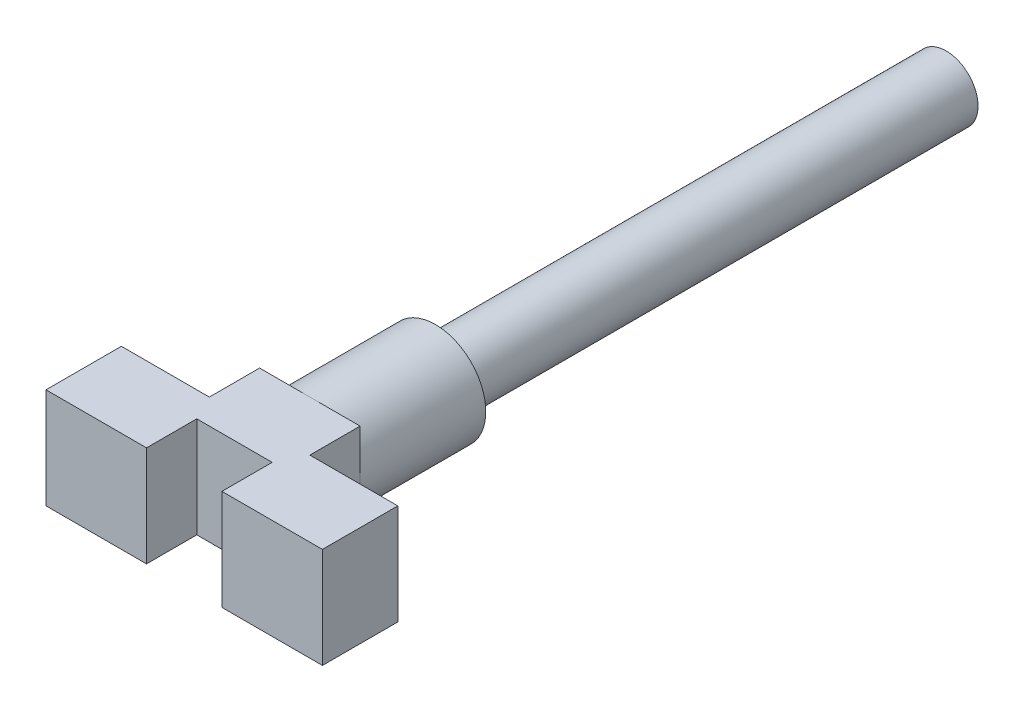
ISO-10303-21;
HEADER;
FILE_DESCRIPTION(('STEP AP214'),'2;1');
FILE_NAME('part.step','',(''),(''),'','','');
FILE_SCHEMA(('AUTOMOTIVE_DESIGN { 1 0 10303 214 1 1 1 1 }'));
ENDSEC;
DATA;
#1=APPLICATION_CONTEXT('core data for automotive mechanical design processes');
#2=APPLICATION_PROTOCOL_DEFINITION('international standard','automotive_design',2000,#1);
#3=PRODUCT_CONTEXT('',#1,'mechanical');
#4=PRODUCT('Part','Part','',(#3));
#5=PRODUCT_RELATED_PRODUCT_CATEGORY('part','',(#4));
#6=PRODUCT_DEFINITION_FORMATION('','',#4);
#7=PRODUCT_DEFINITION_CONTEXT('part definition',#1,'design');
#8=PRODUCT_DEFINITION('design','',#6,#7);
#9=PRODUCT_DEFINITION_SHAPE('','',#8);
#10=(LENGTH_UNIT() NAMED_UNIT(*) SI_UNIT(.MILLI.,.METRE.));
#11=(NAMED_UNIT(*) PLANE_ANGLE_UNIT() SI_UNIT($,.RADIAN.));
#12=(NAMED_UNIT(*) SI_UNIT($,.STERADIAN.) SOLID_ANGLE_UNIT());
#13=UNCERTAINTY_MEASURE_WITH_UNIT(LENGTH_MEASURE(1.E-05),#10,'distance_accuracy_value','');
#14=(GEOMETRIC_REPRESENTATION_CONTEXT(3) GLOBAL_UNCERTAINTY_ASSIGNED_CONTEXT((#13)) GLOBAL_UNIT_ASSIGNED_CONTEXT((#10,
#11,#12)) REPRESENTATION_CONTEXT('',''));
#15=CARTESIAN_POINT('',(0.,0.,0.));
#16=DIRECTION('',(0.,0.,1.));
#17=DIRECTION('',(1.,0.,0.));
#18=AXIS2_PLACEMENT_3D('',#15,#16,#17);
#19=CARTESIAN_POINT('',(0.,0.,-17.5));
#20=DIRECTION('',(0.,0.,-1.));
#21=DIRECTION('',(-1.,0.,0.));
#22=AXIS2_PLACEMENT_3D('',#19,#20,#21);
#23=PLANE('',#22);
#24=CARTESIAN_POINT('',(0.,0.,-17.5));
#25=DIRECTION('',(0.,0.,-1.));
#26=DIRECTION('',(-1.,0.,0.));
#27=AXIS2_PLACEMENT_3D('',#24,#25,#26);
#28=CIRCLE('',#27,5.);
#29=CARTESIAN_POINT('',(-5.,0.,-17.5));
#30=VERTEX_POINT('',#29);
#31=EDGE_CURVE('E157',#30,#30,#28,.T.);
#32=ORIENTED_EDGE('',*,*,#31,.T.);
#33=EDGE_LOOP('',(#32));
#34=FACE_BOUND('',#33,.T.);
#35=CARTESIAN_POINT('',(0.,0.,-17.5));
#36=DIRECTION('',(0.,0.,-1.));
#37=DIRECTION('',(-1.,0.,0.));
#38=AXIS2_PLACEMENT_3D('',#35,#36,#37);
#39=CIRCLE('',#38,3.175);
#40=CARTESIAN_POINT('',(-3.175,0.,-17.5));
#41=VERTEX_POINT('',#40);
#42=EDGE_CURVE('E469',#41,#41,#39,.T.);
#43=ORIENTED_EDGE('',*,*,#42,.F.);
#44=EDGE_LOOP('',(#43));
#45=FACE_BOUND('',#44,.T.);
#46=ADVANCED_FACE('F31',(#34,#45),#23,.T.);
#47=CARTESIAN_POINT('',(5.,5.,-5.));
#48=DIRECTION('',(0.,0.,1.));
#49=DIRECTION('',(1.,0.,0.));
#50=AXIS2_PLACEMENT_3D('',#47,#48,#49);
#51=PLANE('',#50);
#52=CARTESIAN_POINT('',(0.,0.,-5.));
#53=DIRECTION('',(0.,0.,-1.));
#54=DIRECTION('',(-1.,0.,0.));
#55=AXIS2_PLACEMENT_3D('',#52,#53,#54);
#56=CIRCLE('',#55,5.);
#57=CARTESIAN_POINT('',(-5.,0.,-5.));
#58=VERTEX_POINT('',#57);
#59=CARTESIAN_POINT('',(0.,5.,-5.));
#60=VERTEX_POINT('',#59);
#61=EDGE_CURVE('E42',#58,#60,#56,.T.);
#62=ORIENTED_EDGE('',*,*,#61,.F.);
#63=DIRECTION('',(0.,-1.,0.));
#64=VECTOR('',#63,1.);
#65=CARTESIAN_POINT('',(-5.,5.,-5.));
#66=LINE('',#65,#64);
#67=CARTESIAN_POINT('',(-5.,5.,-5.));
#68=VERTEX_POINT('',#67);
#69=EDGE_CURVE('E134',#68,#58,#66,.T.);
#70=ORIENTED_EDGE('',*,*,#69,.F.);
#71=DIRECTION('',(-1.,0.,0.));
#72=VECTOR('',#71,1.);
#73=CARTESIAN_POINT('',(5.,5.,-5.));
#74=LINE('',#73,#72);
#75=EDGE_CURVE('E154',#60,#68,#74,.T.);
#76=ORIENTED_EDGE('',*,*,#75,.F.);
#77=EDGE_LOOP('',(#62,#70,#76));
#78=FACE_BOUND('',#77,.T.);
#79=ADVANCED_FACE('F153',(#78),#51,.F.);
#80=CARTESIAN_POINT('',(5.,0.,-5.));
#81=VERTEX_POINT('',#80);
#82=EDGE_CURVE('E11',#60,#81,#56,.T.);
#83=ORIENTED_EDGE('',*,*,#82,.F.);
#84=CARTESIAN_POINT('',(5.,5.,-5.));
#85=VERTEX_POINT('',#84);
#86=EDGE_CURVE('E167',#85,#60,#74,.T.);
#87=ORIENTED_EDGE('',*,*,#86,.F.);
#88=DIRECTION('',(0.,-1.,0.));
#89=VECTOR('',#88,1.);
#90=CARTESIAN_POINT('',(5.,5.,-5.));
#91=LINE('',#90,#89);
#92=EDGE_CURVE('E35',#85,#81,#91,.T.);
#93=ORIENTED_EDGE('',*,*,#92,.T.);
#94=EDGE_LOOP('',(#83,#87,#93));
#95=FACE_BOUND('',#94,.T.);
#96=ADVANCED_FACE('F265',(#95),#51,.F.);
#97=CARTESIAN_POINT('',(0.,-5.,-5.));
#98=VERTEX_POINT('',#97);
#99=EDGE_CURVE('E40',#81,#98,#56,.T.);
#100=ORIENTED_EDGE('',*,*,#99,.F.);
#101=CARTESIAN_POINT('',(5.,-5.,-5.));
#102=VERTEX_POINT('',#101);
#103=EDGE_CURVE('E143',#81,#102,#91,.T.);
#104=ORIENTED_EDGE('',*,*,#103,.T.);
#105=DIRECTION('',(-1.,0.,0.));
#106=VECTOR('',#105,1.);
#107=CARTESIAN_POINT('',(5.,-5.,-5.));
#108=LINE('',#107,#106);
#109=EDGE_CURVE('E192',#102,#98,#108,.T.);
#110=ORIENTED_EDGE('',*,*,#109,.T.);
#111=EDGE_LOOP('',(#100,#104,#110));
#112=FACE_BOUND('',#111,.T.);
#113=ADVANCED_FACE('F268',(#112),#51,.F.);
#114=EDGE_CURVE('E147',#98,#58,#56,.T.);
#115=ORIENTED_EDGE('',*,*,#114,.F.);
#116=CARTESIAN_POINT('',(-5.,-5.,-5.));
#117=VERTEX_POINT('',#116);
#118=EDGE_CURVE('E149',#98,#117,#108,.T.);
#119=ORIENTED_EDGE('',*,*,#118,.T.);
#120=EDGE_CURVE('E137',#58,#117,#66,.T.);
#121=ORIENTED_EDGE('',*,*,#120,.F.);
#122=EDGE_LOOP('',(#115,#119,#121));
#123=FACE_BOUND('',#122,.T.);
#124=ADVANCED_FACE('F145',(#123),#51,.F.);
#125=CARTESIAN_POINT('',(5.,5.,0.));
#126=DIRECTION('',(-1.,0.,0.));
#127=DIRECTION('',(0.,0.,1.));
#128=AXIS2_PLACEMENT_3D('',#125,#126,#127);
#129=PLANE('',#128);
#130=DIRECTION('',(0.,0.,-1.));
#131=VECTOR('',#130,1.);
#132=CARTESIAN_POINT('',(5.,-5.,0.));
#133=LINE('',#132,#131);
#134=CARTESIAN_POINT('',(5.,-5.,0.));
#135=VERTEX_POINT('',#134);
#136=EDGE_CURVE('E189',#135,#102,#133,.T.);
#137=ORIENTED_EDGE('',*,*,#136,.T.);
#138=ORIENTED_EDGE('',*,*,#103,.F.);
#139=ORIENTED_EDGE('',*,*,#92,.F.);
#140=DIRECTION('',(0.,0.,-1.));
#141=VECTOR('',#140,1.);
#142=CARTESIAN_POINT('',(5.,5.,0.));
#143=LINE('',#142,#141);
#144=CARTESIAN_POINT('',(5.,5.,0.));
#145=VERTEX_POINT('',#144);
#146=EDGE_CURVE('E163',#145,#85,#143,.T.);
#147=ORIENTED_EDGE('',*,*,#146,.F.);
#148=DIRECTION('',(0.,-1.,0.));
#149=VECTOR('',#148,1.);
#150=CARTESIAN_POINT('',(5.,5.,0.));
#151=LINE('',#150,#149);
#152=EDGE_CURVE('E188',#145,#135,#151,.T.);
#153=ORIENTED_EDGE('',*,*,#152,.T.);
#154=EDGE_LOOP('',(#137,#138,#139,#147,#153));
#155=FACE_BOUND('',#154,.T.);
#156=ADVANCED_FACE('F33',(#155),#129,.F.);
#157=CARTESIAN_POINT('',(-5.,5.,-5.));
#158=DIRECTION('',(1.,0.,0.));
#159=DIRECTION('',(0.,0.,-1.));
#160=AXIS2_PLACEMENT_3D('',#157,#158,#159);
#161=PLANE('',#160);
#162=DIRECTION('',(0.,0.,1.));
#163=VECTOR('',#162,1.);
#164=CARTESIAN_POINT('',(-5.,-5.,-5.));
#165=LINE('',#164,#163);
#166=CARTESIAN_POINT('',(-5.,-5.,0.));
#167=VERTEX_POINT('',#166);
#168=EDGE_CURVE('E194',#117,#167,#165,.T.);
#169=ORIENTED_EDGE('',*,*,#168,.T.);
#170=DIRECTION('',(0.,-1.,0.));
#171=VECTOR('',#170,1.);
#172=CARTESIAN_POINT('',(-5.,5.,0.));
#173=LINE('',#172,#171);
#174=CARTESIAN_POINT('',(-5.,5.,0.));
#175=VERTEX_POINT('',#174);
#176=EDGE_CURVE('E151',#175,#167,#173,.T.);
#177=ORIENTED_EDGE('',*,*,#176,.F.);
#178=DIRECTION('',(0.,0.,1.));
#179=VECTOR('',#178,1.);
#180=CARTESIAN_POINT('',(-5.,5.,-5.));
#181=LINE('',#180,#179);
#182=EDGE_CURVE('E140',#68,#175,#181,.T.);
#183=ORIENTED_EDGE('',*,*,#182,.F.);
#184=ORIENTED_EDGE('',*,*,#69,.T.);
#185=ORIENTED_EDGE('',*,*,#120,.T.);
#186=EDGE_LOOP('',(#169,#177,#183,#184,#185));
#187=FACE_BOUND('',#186,.T.);
#188=ADVANCED_FACE('F136',(#187),#161,.F.);
#189=CARTESIAN_POINT('',(-5.,5.,0.));
#190=DIRECTION('',(0.,0.,1.));
#191=DIRECTION('',(1.,0.,0.));
#192=AXIS2_PLACEMENT_3D('',#189,#190,#191);
#193=PLANE('',#192);
#194=DIRECTION('',(-1.,0.,0.));
#195=VECTOR('',#194,1.);
#196=CARTESIAN_POINT('',(-5.,-5.,0.));
#197=LINE('',#196,#195);
#198=CARTESIAN_POINT('',(-13.75,-5.,0.));
#199=VERTEX_POINT('',#198);
#200=EDGE_CURVE('E196',#167,#199,#197,.T.);
#201=ORIENTED_EDGE('',*,*,#200,.T.);
#202=DIRECTION('',(0.,-1.,0.));
#203=VECTOR('',#202,1.);
#204=CARTESIAN_POINT('',(-13.75,5.,0.));
#205=LINE('',#204,#203);
#206=CARTESIAN_POINT('',(-13.75,5.,0.));
#207=VERTEX_POINT('',#206);
#208=EDGE_CURVE('E236',#207,#199,#205,.T.);
#209=ORIENTED_EDGE('',*,*,#208,.F.);
#210=DIRECTION('',(-1.,0.,0.));
#211=VECTOR('',#210,1.);
#212=CARTESIAN_POINT('',(-5.,5.,0.));
#213=LINE('',#212,#211);
#214=EDGE_CURVE('E170',#175,#207,#213,.T.);
#215=ORIENTED_EDGE('',*,*,#214,.F.);
#216=ORIENTED_EDGE('',*,*,#176,.T.);
#217=EDGE_LOOP('',(#201,#209,#215,#216));
#218=FACE_BOUND('',#217,.T.);
#219=ADVANCED_FACE('F243',(#218),#193,.F.);
#220=CARTESIAN_POINT('',(-13.75,5.,0.));
#221=DIRECTION('',(1.,0.,0.));
#222=DIRECTION('',(0.,0.,-1.));
#223=AXIS2_PLACEMENT_3D('',#220,#221,#222);
#224=PLANE('',#223);
#225=DIRECTION('',(0.,0.,1.));
#226=VECTOR('',#225,1.);
#227=CARTESIAN_POINT('',(-13.75,-5.,0.));
#228=LINE('',#227,#226);
#229=CARTESIAN_POINT('',(-13.75,-5.,7.5));
#230=VERTEX_POINT('',#229);
#231=EDGE_CURVE('E198',#199,#230,#228,.T.);
#232=ORIENTED_EDGE('',*,*,#231,.T.);
#233=DIRECTION('',(0.,-1.,0.));
#234=VECTOR('',#233,1.);
#235=CARTESIAN_POINT('',(-13.75,5.,7.5));
#236=LINE('',#235,#234);
#237=CARTESIAN_POINT('',(-13.75,5.,7.5));
#238=VERTEX_POINT('',#237);
#239=EDGE_CURVE('E233',#238,#230,#236,.T.);
#240=ORIENTED_EDGE('',*,*,#239,.F.);
#241=DIRECTION('',(0.,0.,1.));
#242=VECTOR('',#241,1.);
#243=CARTESIAN_POINT('',(-13.75,5.,0.));
#244=LINE('',#243,#242);
#245=EDGE_CURVE('E172',#207,#238,#244,.T.);
#246=ORIENTED_EDGE('',*,*,#245,.F.);
#247=ORIENTED_EDGE('',*,*,#208,.T.);
#248=EDGE_LOOP('',(#232,#240,#246,#247));
#249=FACE_BOUND('',#248,.T.);
#250=ADVANCED_FACE('F253',(#249),#224,.F.);
#251=CARTESIAN_POINT('',(-13.75,5.,7.5));
#252=DIRECTION('',(0.,0.,-1.));
#253=DIRECTION('',(-1.,0.,0.));
#254=AXIS2_PLACEMENT_3D('',#251,#252,#253);
#255=PLANE('',#254);
#256=DIRECTION('',(1.,0.,0.));
#257=VECTOR('',#256,1.);
#258=CARTESIAN_POINT('',(-13.75,-5.,7.5));
#259=LINE('',#258,#257);
#260=CARTESIAN_POINT('',(-3.75,-5.,7.5));
#261=VERTEX_POINT('',#260);
#262=EDGE_CURVE('E200',#230,#261,#259,.T.);
#263=ORIENTED_EDGE('',*,*,#262,.T.);
#264=DIRECTION('',(0.,-1.,0.));
#265=VECTOR('',#264,1.);
#266=CARTESIAN_POINT('',(-3.75,5.,7.5));
#267=LINE('',#266,#265);
#268=CARTESIAN_POINT('',(-3.75,5.,7.5));
#269=VERTEX_POINT('',#268);
#270=EDGE_CURVE('E230',#269,#261,#267,.T.);
#271=ORIENTED_EDGE('',*,*,#270,.F.);
#272=DIRECTION('',(1.,0.,0.));
#273=VECTOR('',#272,1.);
#274=CARTESIAN_POINT('',(-13.75,5.,7.5));
#275=LINE('',#274,#273);
#276=EDGE_CURVE('E174',#238,#269,#275,.T.);
#277=ORIENTED_EDGE('',*,*,#276,.F.);
#278=ORIENTED_EDGE('',*,*,#239,.T.);
#279=EDGE_LOOP('',(#263,#271,#277,#278));
#280=FACE_BOUND('',#279,.T.);
#281=ADVANCED_FACE('F257',(#280),#255,.F.);
#282=CARTESIAN_POINT('',(-3.75,5.,7.5));
#283=DIRECTION('',(-1.,0.,0.));
#284=DIRECTION('',(0.,0.,1.));
#285=AXIS2_PLACEMENT_3D('',#282,#283,#284);
#286=PLANE('',#285);
#287=DIRECTION('',(0.,0.,-1.));
#288=VECTOR('',#287,1.);
#289=CARTESIAN_POINT('',(-3.75,-5.,7.5));
#290=LINE('',#289,#288);
#291=CARTESIAN_POINT('',(-3.75,-5.,2.5));
#292=VERTEX_POINT('',#291);
#293=EDGE_CURVE('E202',#261,#292,#290,.T.);
#294=ORIENTED_EDGE('',*,*,#293,.T.);
#295=DIRECTION('',(0.,-1.,0.));
#296=VECTOR('',#295,1.);
#297=CARTESIAN_POINT('',(-3.75,5.,2.5));
#298=LINE('',#297,#296);
#299=CARTESIAN_POINT('',(-3.75,5.,2.5));
#300=VERTEX_POINT('',#299);
#301=EDGE_CURVE('E227',#300,#292,#298,.T.);
#302=ORIENTED_EDGE('',*,*,#301,.F.);
#303=DIRECTION('',(0.,0.,-1.));
#304=VECTOR('',#303,1.);
#305=CARTESIAN_POINT('',(-3.75,5.,7.5));
#306=LINE('',#305,#304);
#307=EDGE_CURVE('E176',#269,#300,#306,.T.);
#308=ORIENTED_EDGE('',*,*,#307,.F.);
#309=ORIENTED_EDGE('',*,*,#270,.T.);
#310=EDGE_LOOP('',(#294,#302,#308,#309));
#311=FACE_BOUND('',#310,.T.);
#312=ADVANCED_FACE('F295',(#311),#286,.F.);
#313=CARTESIAN_POINT('',(-3.75,5.,2.5));
#314=DIRECTION('',(0.,0.,-1.));
#315=DIRECTION('',(-1.,0.,0.));
#316=AXIS2_PLACEMENT_3D('',#313,#314,#315);
#317=PLANE('',#316);
#318=DIRECTION('',(1.,0.,0.));
#319=VECTOR('',#318,1.);
#320=CARTESIAN_POINT('',(-3.75,-5.,2.5));
#321=LINE('',#320,#319);
#322=CARTESIAN_POINT('',(3.75,-5.,2.5));
#323=VERTEX_POINT('',#322);
#324=EDGE_CURVE('E204',#292,#323,#321,.T.);
#325=ORIENTED_EDGE('',*,*,#324,.T.);
#326=DIRECTION('',(0.,-1.,0.));
#327=VECTOR('',#326,1.);
#328=CARTESIAN_POINT('',(3.75,5.,2.5));
#329=LINE('',#328,#327);
#330=CARTESIAN_POINT('',(3.75,5.,2.5));
#331=VERTEX_POINT('',#330);
#332=EDGE_CURVE('E224',#331,#323,#329,.T.);
#333=ORIENTED_EDGE('',*,*,#332,.F.);
#334=DIRECTION('',(1.,0.,0.));
#335=VECTOR('',#334,1.);
#336=CARTESIAN_POINT('',(-3.75,5.,2.5));
#337=LINE('',#336,#335);
#338=EDGE_CURVE('E178',#300,#331,#337,.T.);
#339=ORIENTED_EDGE('',*,*,#338,.F.);
#340=ORIENTED_EDGE('',*,*,#301,.T.);
#341=EDGE_LOOP('',(#325,#333,#339,#340));
#342=FACE_BOUND('',#341,.T.);
#343=ADVANCED_FACE('F293',(#342),#317,.F.);
#344=CARTESIAN_POINT('',(3.75,5.,2.5));
#345=DIRECTION('',(1.,0.,0.));
#346=DIRECTION('',(0.,0.,-1.));
#347=AXIS2_PLACEMENT_3D('',#344,#345,#346);
#348=PLANE('',#347);
#349=DIRECTION('',(0.,0.,1.));
#350=VECTOR('',#349,1.);
#351=CARTESIAN_POINT('',(3.75,-5.,2.5));
#352=LINE('',#351,#350);
#353=CARTESIAN_POINT('',(3.75,-5.,7.5));
#354=VERTEX_POINT('',#353);
#355=EDGE_CURVE('E206',#323,#354,#352,.T.);
#356=ORIENTED_EDGE('',*,*,#355,.T.);
#357=DIRECTION('',(0.,-1.,0.));
#358=VECTOR('',#357,1.);
#359=CARTESIAN_POINT('',(3.75,5.,7.5));
#360=LINE('',#359,#358);
#361=CARTESIAN_POINT('',(3.75,5.,7.5));
#362=VERTEX_POINT('',#361);
#363=EDGE_CURVE('E221',#362,#354,#360,.T.);
#364=ORIENTED_EDGE('',*,*,#363,.F.);
#365=DIRECTION('',(0.,0.,1.));
#366=VECTOR('',#365,1.);
#367=CARTESIAN_POINT('',(3.75,5.,2.5));
#368=LINE('',#367,#366);
#369=EDGE_CURVE('E180',#331,#362,#368,.T.);
#370=ORIENTED_EDGE('',*,*,#369,.F.);
#371=ORIENTED_EDGE('',*,*,#332,.T.);
#372=EDGE_LOOP('',(#356,#364,#370,#371));
#373=FACE_BOUND('',#372,.T.);
#374=ADVANCED_FACE('F288',(#373),#348,.F.);
#375=CARTESIAN_POINT('',(3.75,5.,7.5));
#376=DIRECTION('',(0.,0.,-1.));
#377=DIRECTION('',(-1.,0.,0.));
#378=AXIS2_PLACEMENT_3D('',#375,#376,#377);
#379=PLANE('',#378);
#380=DIRECTION('',(1.,0.,0.));
#381=VECTOR('',#380,1.);
#382=CARTESIAN_POINT('',(3.75,-5.,7.5));
#383=LINE('',#382,#381);
#384=CARTESIAN_POINT('',(13.75,-5.,7.5));
#385=VERTEX_POINT('',#384);
#386=EDGE_CURVE('E208',#354,#385,#383,.T.);
#387=ORIENTED_EDGE('',*,*,#386,.T.);
#388=DIRECTION('',(0.,-1.,0.));
#389=VECTOR('',#388,1.);
#390=CARTESIAN_POINT('',(13.75,5.,7.5));
#391=LINE('',#390,#389);
#392=CARTESIAN_POINT('',(13.75,5.,7.5));
#393=VERTEX_POINT('',#392);
#394=EDGE_CURVE('E218',#393,#385,#391,.T.);
#395=ORIENTED_EDGE('',*,*,#394,.F.);
#396=DIRECTION('',(1.,0.,0.));
#397=VECTOR('',#396,1.);
#398=CARTESIAN_POINT('',(3.75,5.,7.5));
#399=LINE('',#398,#397);
#400=EDGE_CURVE('E182',#362,#393,#399,.T.);
#401=ORIENTED_EDGE('',*,*,#400,.F.);
#402=ORIENTED_EDGE('',*,*,#363,.T.);
#403=EDGE_LOOP('',(#387,#395,#401,#402));
#404=FACE_BOUND('',#403,.T.);
#405=ADVANCED_FACE('F283',(#404),#379,.F.);
#406=CARTESIAN_POINT('',(13.75,5.,7.5));
#407=DIRECTION('',(-1.,0.,0.));
#408=DIRECTION('',(0.,0.,1.));
#409=AXIS2_PLACEMENT_3D('',#406,#407,#408);
#410=PLANE('',#409);
#411=DIRECTION('',(0.,0.,-1.));
#412=VECTOR('',#411,1.);
#413=CARTESIAN_POINT('',(13.75,-5.,7.5));
#414=LINE('',#413,#412);
#415=CARTESIAN_POINT('',(13.75,-5.,0.));
#416=VERTEX_POINT('',#415);
#417=EDGE_CURVE('E210',#385,#416,#414,.T.);
#418=ORIENTED_EDGE('',*,*,#417,.T.);
#419=DIRECTION('',(0.,-1.,0.));
#420=VECTOR('',#419,1.);
#421=CARTESIAN_POINT('',(13.75,5.,0.));
#422=LINE('',#421,#420);
#423=CARTESIAN_POINT('',(13.75,5.,0.));
#424=VERTEX_POINT('',#423);
#425=EDGE_CURVE('E215',#424,#416,#422,.T.);
#426=ORIENTED_EDGE('',*,*,#425,.F.);
#427=DIRECTION('',(0.,0.,-1.));
#428=VECTOR('',#427,1.);
#429=CARTESIAN_POINT('',(13.75,5.,7.5));
#430=LINE('',#429,#428);
#431=EDGE_CURVE('E184',#393,#424,#430,.T.);
#432=ORIENTED_EDGE('',*,*,#431,.F.);
#433=ORIENTED_EDGE('',*,*,#394,.T.);
#434=EDGE_LOOP('',(#418,#426,#432,#433));
#435=FACE_BOUND('',#434,.T.);
#436=ADVANCED_FACE('F279',(#435),#410,.F.);
#437=CARTESIAN_POINT('',(13.75,5.,0.));
#438=DIRECTION('',(0.,0.,1.));
#439=DIRECTION('',(1.,0.,0.));
#440=AXIS2_PLACEMENT_3D('',#437,#438,#439);
#441=PLANE('',#440);
#442=DIRECTION('',(-1.,0.,0.));
#443=VECTOR('',#442,1.);
#444=CARTESIAN_POINT('',(13.75,-5.,0.));
#445=LINE('',#444,#443);
#446=EDGE_CURVE('E166',#416,#135,#445,.T.);
#447=ORIENTED_EDGE('',*,*,#446,.T.);
#448=ORIENTED_EDGE('',*,*,#152,.F.);
#449=DIRECTION('',(-1.,0.,0.));
#450=VECTOR('',#449,1.);
#451=CARTESIAN_POINT('',(13.75,5.,0.));
#452=LINE('',#451,#450);
#453=EDGE_CURVE('E186',#424,#145,#452,.T.);
#454=ORIENTED_EDGE('',*,*,#453,.F.);
#455=ORIENTED_EDGE('',*,*,#425,.T.);
#456=EDGE_LOOP('',(#447,#448,#454,#455));
#457=FACE_BOUND('',#456,.T.);
#458=ADVANCED_FACE('F274',(#457),#441,.F.);
#459=CARTESIAN_POINT('',(5.,5.,-5.));
#460=DIRECTION('',(0.,1.,0.));
#461=DIRECTION('',(0.,0.,1.));
#462=AXIS2_PLACEMENT_3D('',#459,#460,#461);
#463=PLANE('',#462);
#464=ORIENTED_EDGE('',*,*,#146,.T.);
#465=ORIENTED_EDGE('',*,*,#86,.T.);
#466=ORIENTED_EDGE('',*,*,#75,.T.);
#467=ORIENTED_EDGE('',*,*,#182,.T.);
#468=ORIENTED_EDGE('',*,*,#214,.T.);
#469=ORIENTED_EDGE('',*,*,#245,.T.);
#470=ORIENTED_EDGE('',*,*,#276,.T.);
#471=ORIENTED_EDGE('',*,*,#307,.T.);
#472=ORIENTED_EDGE('',*,*,#338,.T.);
#473=ORIENTED_EDGE('',*,*,#369,.T.);
#474=ORIENTED_EDGE('',*,*,#400,.T.);
#475=ORIENTED_EDGE('',*,*,#431,.T.);
#476=ORIENTED_EDGE('',*,*,#453,.T.);
#477=EDGE_LOOP('',(#464,#465,#466,#467,#468,#469,#470,#471,#472,#473,#474,#475,#476));
#478=FACE_BOUND('',#477,.T.);
#479=ADVANCED_FACE('F261',(#478),#463,.T.);
#480=CARTESIAN_POINT('',(5.,-5.,-5.));
#481=DIRECTION('',(0.,1.,0.));
#482=DIRECTION('',(0.,0.,1.));
#483=AXIS2_PLACEMENT_3D('',#480,#481,#482);
#484=PLANE('',#483);
#485=ORIENTED_EDGE('',*,*,#136,.F.);
#486=ORIENTED_EDGE('',*,*,#446,.F.);
#487=ORIENTED_EDGE('',*,*,#417,.F.);
#488=ORIENTED_EDGE('',*,*,#386,.F.);
#489=ORIENTED_EDGE('',*,*,#355,.F.);
#490=ORIENTED_EDGE('',*,*,#324,.F.);
#491=ORIENTED_EDGE('',*,*,#293,.F.);
#492=ORIENTED_EDGE('',*,*,#262,.F.);
#493=ORIENTED_EDGE('',*,*,#231,.F.);
#494=ORIENTED_EDGE('',*,*,#200,.F.);
#495=ORIENTED_EDGE('',*,*,#168,.F.);
#496=ORIENTED_EDGE('',*,*,#118,.F.);
#497=ORIENTED_EDGE('',*,*,#109,.F.);
#498=EDGE_LOOP('',(#485,#486,#487,#488,#489,#490,#491,#492,#493,#494,#495,#496,#497));
#499=FACE_BOUND('',#498,.T.);
#500=ADVANCED_FACE('F248',(#499),#484,.F.);
#501=CARTESIAN_POINT('',(0.,0.,-17.5));
#502=DIRECTION('',(0.,0.,1.));
#503=DIRECTION('',(1.,0.,0.));
#504=AXIS2_PLACEMENT_3D('',#501,#502,#503);
#505=CYLINDRICAL_SURFACE('',#504,5.);
#506=ORIENTED_EDGE('',*,*,#31,.F.);
#507=EDGE_LOOP('',(#506));
#508=FACE_BOUND('',#507,.T.);
#509=ORIENTED_EDGE('',*,*,#61,.T.);
#510=ORIENTED_EDGE('',*,*,#82,.T.);
#511=ORIENTED_EDGE('',*,*,#99,.T.);
#512=ORIENTED_EDGE('',*,*,#114,.T.);
#513=EDGE_LOOP('',(#509,#510,#511,#512));
#514=FACE_BOUND('',#513,.T.);
#515=ADVANCED_FACE('F159',(#508,#514),#505,.T.);
#516=CARTESIAN_POINT('',(0.,0.,-68.3));
#517=DIRECTION('',(0.,0.,1.));
#518=DIRECTION('',(1.,0.,0.));
#519=AXIS2_PLACEMENT_3D('',#516,#517,#518);
#520=CYLINDRICAL_SURFACE('',#519,3.175);
#521=CARTESIAN_POINT('',(0.,0.,-68.3));
#522=DIRECTION('',(0.,0.,-1.));
#523=DIRECTION('',(-1.,0.,0.));
#524=AXIS2_PLACEMENT_3D('',#521,#522,#523);
#525=CIRCLE('',#524,3.175);
#526=CARTESIAN_POINT('',(-3.175,0.,-68.3));
#527=VERTEX_POINT('',#526);
#528=EDGE_CURVE('E158',#527,#527,#525,.T.);
#529=ORIENTED_EDGE('',*,*,#528,.F.);
#530=EDGE_LOOP('',(#529));
#531=FACE_BOUND('',#530,.T.);
#532=ORIENTED_EDGE('',*,*,#42,.T.);
#533=EDGE_LOOP('',(#532));
#534=FACE_BOUND('',#533,.T.);
#535=ADVANCED_FACE('F314',(#531,#534),#520,.T.);
#536=CARTESIAN_POINT('',(0.,0.,-68.3));
#537=DIRECTION('',(0.,0.,-1.));
#538=DIRECTION('',(-1.,0.,0.));
#539=AXIS2_PLACEMENT_3D('',#536,#537,#538);
#540=PLANE('',#539);
#541=ORIENTED_EDGE('',*,*,#528,.T.);
#542=EDGE_LOOP('',(#541));
#543=FACE_BOUND('',#542,.T.);
#544=ADVANCED_FACE('F366',(#543),#540,.T.);
#545=CLOSED_SHELL('',(#46,#79,#96,#113,#124,#156,#188,#219,#250,#281,#312,#343,#374,#405,#436,
#458,#479,#500,#515,#535,#544));
#546=MANIFOLD_SOLID_BREP('B2',#545);
#547=ADVANCED_BREP_SHAPE_REPRESENTATION('',(#18,#546),#14);
#548=SHAPE_DEFINITION_REPRESENTATION(#9,#547);
ENDSEC;
END-ISO-10303-21;
